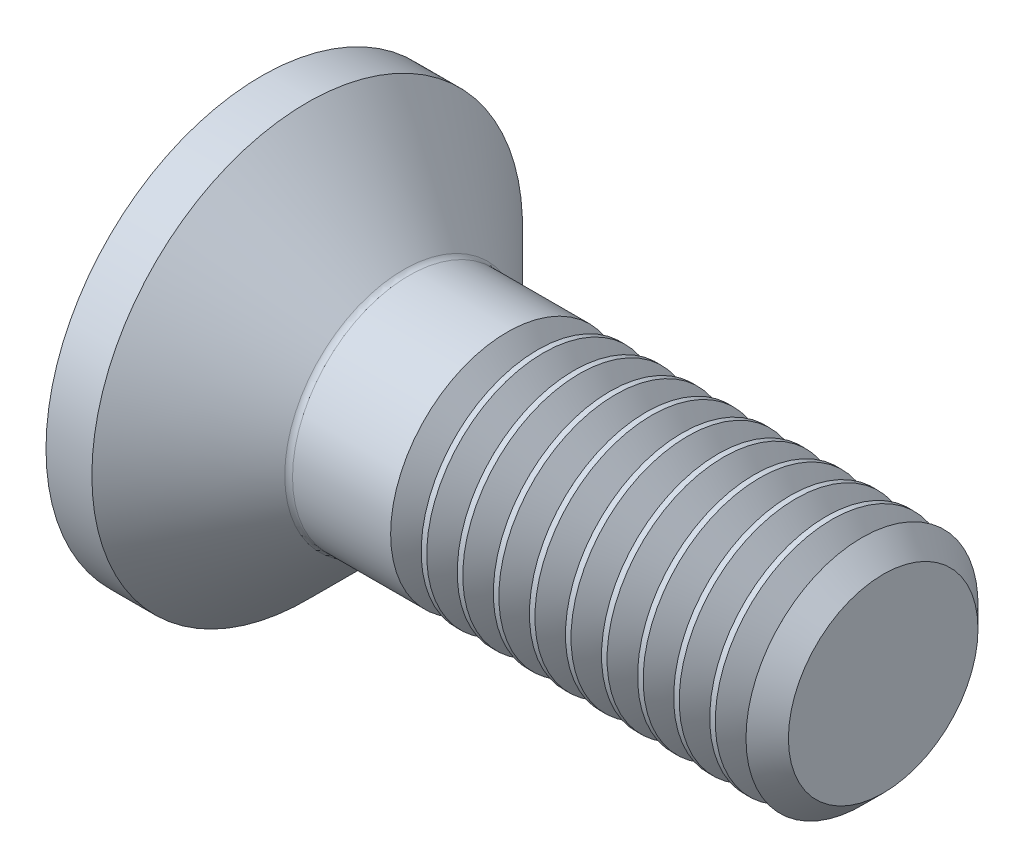
ISO-10303-21;
HEADER;
FILE_DESCRIPTION(('STEP AP214'),'2;1');
FILE_NAME('part.step','',(''),(''),'','','');
FILE_SCHEMA(('AUTOMOTIVE_DESIGN { 1 0 10303 214 1 1 1 1 }'));
ENDSEC;
DATA;
#1=APPLICATION_CONTEXT('core data for automotive mechanical design processes');
#2=APPLICATION_PROTOCOL_DEFINITION('international standard','automotive_design',2000,#1);
#3=PRODUCT_CONTEXT('',#1,'mechanical');
#4=PRODUCT('Part','Part','',(#3));
#5=PRODUCT_RELATED_PRODUCT_CATEGORY('part','',(#4));
#6=PRODUCT_DEFINITION_FORMATION('','',#4);
#7=PRODUCT_DEFINITION_CONTEXT('part definition',#1,'design');
#8=PRODUCT_DEFINITION('design','',#6,#7);
#9=PRODUCT_DEFINITION_SHAPE('','',#8);
#10=(LENGTH_UNIT() NAMED_UNIT(*) SI_UNIT(.MILLI.,.METRE.));
#11=(NAMED_UNIT(*) PLANE_ANGLE_UNIT() SI_UNIT($,.RADIAN.));
#12=(NAMED_UNIT(*) SI_UNIT($,.STERADIAN.) SOLID_ANGLE_UNIT());
#13=UNCERTAINTY_MEASURE_WITH_UNIT(LENGTH_MEASURE(1.E-05),#10,'distance_accuracy_value','');
#14=(GEOMETRIC_REPRESENTATION_CONTEXT(3) GLOBAL_UNCERTAINTY_ASSIGNED_CONTEXT((#13)) GLOBAL_UNIT_ASSIGNED_CONTEXT((#10,
#11,#12)) REPRESENTATION_CONTEXT('',''));
#15=CARTESIAN_POINT('',(0.,0.,0.));
#16=DIRECTION('',(0.,0.,1.));
#17=DIRECTION('',(1.,0.,0.));
#18=AXIS2_PLACEMENT_3D('',#15,#16,#17);
#19=CARTESIAN_POINT('',(0.,0.,0.));
#20=DIRECTION('',(-1.,0.,0.));
#21=DIRECTION('',(0.,0.,1.));
#22=AXIS2_PLACEMENT_3D('',#19,#20,#21);
#23=PLANE('',#22);
#24=CARTESIAN_POINT('',(0.,0.,0.));
#25=DIRECTION('',(-1.,0.,0.));
#26=DIRECTION('',(0.,0.,1.));
#27=AXIS2_PLACEMENT_3D('',#24,#25,#26);
#28=CIRCLE('',#27,2.77);
#29=CARTESIAN_POINT('',(0.,0.,2.77));
#30=VERTEX_POINT('',#29);
#31=EDGE_CURVE('E150',#30,#30,#28,.T.);
#32=ORIENTED_EDGE('',*,*,#31,.T.);
#33=EDGE_LOOP('',(#32));
#34=FACE_BOUND('',#33,.T.);
#35=DIRECTION('',(0.,-0.499999999999998,-0.86602540378444));
#36=VECTOR('',#35,1.);
#37=CARTESIAN_POINT('',(0.,-0.577350269189626,1.));
#38=LINE('',#37,#36);
#39=CARTESIAN_POINT('',(0.,-0.577350269189626,1.));
#40=VERTEX_POINT('',#39);
#41=CARTESIAN_POINT('',(0.,-1.15470053837925,0.));
#42=VERTEX_POINT('',#41);
#43=EDGE_CURVE('E119',#40,#42,#38,.T.);
#44=ORIENTED_EDGE('',*,*,#43,.T.);
#45=DIRECTION('',(0.,0.499999999999999,-0.866025403784439));
#46=VECTOR('',#45,1.);
#47=CARTESIAN_POINT('',(0.,-1.15470053837925,0.));
#48=LINE('',#47,#46);
#49=CARTESIAN_POINT('',(0.,-0.577350269189625,-1.));
#50=VERTEX_POINT('',#49);
#51=EDGE_CURVE('E50',#42,#50,#48,.T.);
#52=ORIENTED_EDGE('',*,*,#51,.T.);
#53=DIRECTION('',(0.,1.,0.));
#54=VECTOR('',#53,1.);
#55=CARTESIAN_POINT('',(0.,-0.577350269189625,-1.));
#56=LINE('',#55,#54);
#57=CARTESIAN_POINT('',(0.,0.577350269189626,-1.));
#58=VERTEX_POINT('',#57);
#59=EDGE_CURVE('E130',#50,#58,#56,.T.);
#60=ORIENTED_EDGE('',*,*,#59,.T.);
#61=DIRECTION('',(0.,0.5,0.866025403784439));
#62=VECTOR('',#61,1.);
#63=CARTESIAN_POINT('',(0.,0.577350269189626,-1.));
#64=LINE('',#63,#62);
#65=CARTESIAN_POINT('',(0.,1.15470053837925,0.));
#66=VERTEX_POINT('',#65);
#67=EDGE_CURVE('E415',#58,#66,#64,.T.);
#68=ORIENTED_EDGE('',*,*,#67,.T.);
#69=DIRECTION('',(0.,-0.499999999999999,0.866025403784439));
#70=VECTOR('',#69,1.);
#71=CARTESIAN_POINT('',(0.,1.15470053837925,0.));
#72=LINE('',#71,#70);
#73=CARTESIAN_POINT('',(0.,0.577350269189625,0.999999999999999));
#74=VERTEX_POINT('',#73);
#75=EDGE_CURVE('E418',#66,#74,#72,.T.);
#76=ORIENTED_EDGE('',*,*,#75,.T.);
#77=DIRECTION('',(0.,-1.,0.));
#78=VECTOR('',#77,1.);
#79=CARTESIAN_POINT('',(0.,0.577350269189625,0.999999999999999));
#80=LINE('',#79,#78);
#81=EDGE_CURVE('E421',#74,#40,#80,.T.);
#82=ORIENTED_EDGE('',*,*,#81,.T.);
#83=EDGE_LOOP('',(#44,#52,#60,#68,#76,#82));
#84=FACE_BOUND('',#83,.T.);
#85=ADVANCED_FACE('F34',(#34,#84),#23,.T.);
#86=CARTESIAN_POINT('',(0.,0.,0.));
#87=DIRECTION('',(-1.,0.,0.));
#88=DIRECTION('',(0.,0.,1.));
#89=AXIS2_PLACEMENT_3D('',#86,#87,#88);
#90=CYLINDRICAL_SURFACE('',#89,2.77);
#91=CARTESIAN_POINT('',(0.590000000000013,0.,0.));
#92=DIRECTION('',(-1.,0.,0.));
#93=DIRECTION('',(0.,0.,1.));
#94=AXIS2_PLACEMENT_3D('',#91,#92,#93);
#95=CIRCLE('',#94,2.77);
#96=CARTESIAN_POINT('',(0.590000000000013,0.,2.77));
#97=VERTEX_POINT('',#96);
#98=EDGE_CURVE('E147',#97,#97,#95,.T.);
#99=ORIENTED_EDGE('',*,*,#98,.T.);
#100=EDGE_LOOP('',(#99));
#101=FACE_BOUND('',#100,.T.);
#102=ORIENTED_EDGE('',*,*,#31,.F.);
#103=EDGE_LOOP('',(#102));
#104=FACE_BOUND('',#103,.T.);
#105=ADVANCED_FACE('F173',(#101,#104),#90,.T.);
#106=CARTESIAN_POINT('',(0.590000000000013,0.,0.));
#107=DIRECTION('',(-1.,0.,0.));
#108=DIRECTION('',(0.,0.,1.));
#109=AXIS2_PLACEMENT_3D('',#106,#107,#108);
#110=CONICAL_SURFACE('',#109,2.77,0.785398163397451);
#111=CARTESIAN_POINT('',(1.83071067811866,0.,0.));
#112=DIRECTION('',(-1.,0.,0.));
#113=DIRECTION('',(0.,0.,1.));
#114=AXIS2_PLACEMENT_3D('',#111,#112,#113);
#115=CIRCLE('',#114,1.52928932188135);
#116=CARTESIAN_POINT('',(1.83071067811866,0.,1.52928932188135));
#117=VERTEX_POINT('',#116);
#118=EDGE_CURVE('E43',#117,#117,#115,.T.);
#119=ORIENTED_EDGE('',*,*,#118,.T.);
#120=EDGE_LOOP('',(#119));
#121=FACE_BOUND('',#120,.T.);
#122=ORIENTED_EDGE('',*,*,#98,.F.);
#123=EDGE_LOOP('',(#122));
#124=FACE_BOUND('',#123,.T.);
#125=ADVANCED_FACE('F156',(#121,#124),#110,.T.);
#126=CARTESIAN_POINT('',(0.,0.,0.));
#127=DIRECTION('',(-1.,0.,0.));
#128=DIRECTION('',(0.,0.,1.));
#129=AXIS2_PLACEMENT_3D('',#126,#127,#128);
#130=CYLINDRICAL_SURFACE('',#129,1.5);
#131=CARTESIAN_POINT('',(3.16359278553217,0.,0.));
#132=DIRECTION('',(-1.,0.,0.));
#133=DIRECTION('',(0.,-1.,0.));
#134=AXIS2_PLACEMENT_3D('',#131,#132,#133);
#135=CIRCLE('',#134,1.5);
#136=CARTESIAN_POINT('',(3.16359278553217,-1.5,0.));
#137=VERTEX_POINT('',#136);
#138=EDGE_CURVE('E391',#137,#137,#135,.T.);
#139=ORIENTED_EDGE('',*,*,#138,.T.);
#140=EDGE_LOOP('',(#139));
#141=FACE_BOUND('',#140,.T.);
#142=CARTESIAN_POINT('',(1.90142135623731,0.,0.));
#143=DIRECTION('',(-1.,0.,0.));
#144=DIRECTION('',(0.,0.,1.));
#145=AXIS2_PLACEMENT_3D('',#142,#143,#144);
#146=CIRCLE('',#145,1.5);
#147=CARTESIAN_POINT('',(1.90142135623731,0.,1.5));
#148=VERTEX_POINT('',#147);
#149=EDGE_CURVE('E11',#148,#148,#146,.F.);
#150=ORIENTED_EDGE('',*,*,#149,.T.);
#151=EDGE_LOOP('',(#150));
#152=FACE_BOUND('',#151,.T.);
#153=ADVANCED_FACE('F160',(#141,#152),#130,.T.);
#154=CARTESIAN_POINT('',(1.90142135623731,0.,0.));
#155=DIRECTION('',(-1.,0.,0.));
#156=DIRECTION('',(0.,0.,1.));
#157=AXIS2_PLACEMENT_3D('',#154,#155,#156);
#158=TOROIDAL_SURFACE('',#157,1.6,0.1);
#159=ORIENTED_EDGE('',*,*,#149,.F.);
#160=EDGE_LOOP('',(#159));
#161=FACE_BOUND('',#160,.T.);
#162=ORIENTED_EDGE('',*,*,#118,.F.);
#163=EDGE_LOOP('',(#162));
#164=FACE_BOUND('',#163,.T.);
#165=ADVANCED_FACE('F36',(#161,#164),#158,.F.);
#166=CARTESIAN_POINT('',(1.1,-1.15470053837925,0.));
#167=DIRECTION('',(0.,0.866025403784439,0.499999999999999));
#168=DIRECTION('',(0.,-0.499999999999999,0.866025403784439));
#169=AXIS2_PLACEMENT_3D('',#166,#167,#168);
#170=PLANE('',#169);
#171=ORIENTED_EDGE('',*,*,#51,.F.);
#172=DIRECTION('',(-1.,0.,0.));
#173=VECTOR('',#172,1.);
#174=CARTESIAN_POINT('',(1.1,-1.15470053837925,0.));
#175=LINE('',#174,#173);
#176=CARTESIAN_POINT('',(1.1,-1.15470053837925,0.));
#177=VERTEX_POINT('',#176);
#178=EDGE_CURVE('E412',#177,#42,#175,.T.);
#179=ORIENTED_EDGE('',*,*,#178,.F.);
#180=DIRECTION('',(0.,0.499999999999999,-0.866025403784439));
#181=VECTOR('',#180,1.);
#182=CARTESIAN_POINT('',(1.1,-1.15470053837925,0.));
#183=LINE('',#182,#181);
#184=CARTESIAN_POINT('',(1.1,-0.866025403784438,-0.499999999999998));
#185=VERTEX_POINT('',#184);
#186=EDGE_CURVE('E115',#177,#185,#183,.T.);
#187=ORIENTED_EDGE('',*,*,#186,.T.);
#188=CARTESIAN_POINT('',(1.1,-0.577350269189625,-1.));
#189=VERTEX_POINT('',#188);
#190=EDGE_CURVE('E111',#185,#189,#183,.T.);
#191=ORIENTED_EDGE('',*,*,#190,.T.);
#192=DIRECTION('',(-1.,0.,0.));
#193=VECTOR('',#192,1.);
#194=CARTESIAN_POINT('',(1.1,-0.577350269189625,-1.));
#195=LINE('',#194,#193);
#196=EDGE_CURVE('E113',#189,#50,#195,.T.);
#197=ORIENTED_EDGE('',*,*,#196,.T.);
#198=EDGE_LOOP('',(#171,#179,#187,#191,#197));
#199=FACE_BOUND('',#198,.T.);
#200=ADVANCED_FACE('F112',(#199),#170,.T.);
#201=CARTESIAN_POINT('',(1.1,-0.577350269189625,-1.));
#202=DIRECTION('',(0.,0.,1.));
#203=DIRECTION('',(1.,0.,0.));
#204=AXIS2_PLACEMENT_3D('',#201,#202,#203);
#205=PLANE('',#204);
#206=ORIENTED_EDGE('',*,*,#59,.F.);
#207=ORIENTED_EDGE('',*,*,#196,.F.);
#208=DIRECTION('',(0.,1.,0.));
#209=VECTOR('',#208,1.);
#210=CARTESIAN_POINT('',(1.1,-0.577350269189625,-1.));
#211=LINE('',#210,#209);
#212=CARTESIAN_POINT('',(1.1,0.,-1.));
#213=VERTEX_POINT('',#212);
#214=EDGE_CURVE('E58',#189,#213,#211,.T.);
#215=ORIENTED_EDGE('',*,*,#214,.T.);
#216=CARTESIAN_POINT('',(1.1,0.577350269189626,-1.));
#217=VERTEX_POINT('',#216);
#218=EDGE_CURVE('E125',#213,#217,#211,.T.);
#219=ORIENTED_EDGE('',*,*,#218,.T.);
#220=DIRECTION('',(-1.,0.,0.));
#221=VECTOR('',#220,1.);
#222=CARTESIAN_POINT('',(1.1,0.577350269189626,-1.));
#223=LINE('',#222,#221);
#224=EDGE_CURVE('E132',#217,#58,#223,.T.);
#225=ORIENTED_EDGE('',*,*,#224,.T.);
#226=EDGE_LOOP('',(#206,#207,#215,#219,#225));
#227=FACE_BOUND('',#226,.T.);
#228=ADVANCED_FACE('F127',(#227),#205,.T.);
#229=CARTESIAN_POINT('',(1.1,0.577350269189626,-1.));
#230=DIRECTION('',(0.,-0.866025403784438,0.5));
#231=DIRECTION('',(0.,-0.5,-0.866025403784439));
#232=AXIS2_PLACEMENT_3D('',#229,#230,#231);
#233=PLANE('',#232);
#234=ORIENTED_EDGE('',*,*,#67,.F.);
#235=ORIENTED_EDGE('',*,*,#224,.F.);
#236=DIRECTION('',(0.,0.5,0.866025403784439));
#237=VECTOR('',#236,1.);
#238=CARTESIAN_POINT('',(1.1,0.577350269189626,-1.));
#239=LINE('',#238,#237);
#240=CARTESIAN_POINT('',(1.1,0.866025403784439,-0.5));
#241=VERTEX_POINT('',#240);
#242=EDGE_CURVE('E397',#217,#241,#239,.T.);
#243=ORIENTED_EDGE('',*,*,#242,.T.);
#244=CARTESIAN_POINT('',(1.1,1.15470053837925,0.));
#245=VERTEX_POINT('',#244);
#246=EDGE_CURVE('E124',#241,#245,#239,.T.);
#247=ORIENTED_EDGE('',*,*,#246,.T.);
#248=DIRECTION('',(-1.,0.,0.));
#249=VECTOR('',#248,1.);
#250=CARTESIAN_POINT('',(1.1,1.15470053837925,0.));
#251=LINE('',#250,#249);
#252=EDGE_CURVE('E138',#245,#66,#251,.T.);
#253=ORIENTED_EDGE('',*,*,#252,.T.);
#254=EDGE_LOOP('',(#234,#235,#243,#247,#253));
#255=FACE_BOUND('',#254,.T.);
#256=ADVANCED_FACE('F201',(#255),#233,.T.);
#257=CARTESIAN_POINT('',(1.1,1.15470053837925,0.));
#258=DIRECTION('',(0.,-0.866025403784439,-0.499999999999999));
#259=DIRECTION('',(0.,0.499999999999999,-0.866025403784439));
#260=AXIS2_PLACEMENT_3D('',#257,#258,#259);
#261=PLANE('',#260);
#262=ORIENTED_EDGE('',*,*,#75,.F.);
#263=ORIENTED_EDGE('',*,*,#252,.F.);
#264=DIRECTION('',(0.,-0.499999999999999,0.866025403784439));
#265=VECTOR('',#264,1.);
#266=CARTESIAN_POINT('',(1.1,1.15470053837925,0.));
#267=LINE('',#266,#265);
#268=CARTESIAN_POINT('',(1.1,0.866025403784438,0.499999999999999));
#269=VERTEX_POINT('',#268);
#270=EDGE_CURVE('E401',#245,#269,#267,.T.);
#271=ORIENTED_EDGE('',*,*,#270,.T.);
#272=CARTESIAN_POINT('',(1.1,0.577350269189625,0.999999999999999));
#273=VERTEX_POINT('',#272);
#274=EDGE_CURVE('E400',#269,#273,#267,.T.);
#275=ORIENTED_EDGE('',*,*,#274,.T.);
#276=DIRECTION('',(-1.,0.,0.));
#277=VECTOR('',#276,1.);
#278=CARTESIAN_POINT('',(1.1,0.577350269189625,0.999999999999999));
#279=LINE('',#278,#277);
#280=EDGE_CURVE('E430',#273,#74,#279,.T.);
#281=ORIENTED_EDGE('',*,*,#280,.T.);
#282=EDGE_LOOP('',(#262,#263,#271,#275,#281));
#283=FACE_BOUND('',#282,.T.);
#284=ADVANCED_FACE('F204',(#283),#261,.T.);
#285=CARTESIAN_POINT('',(1.1,0.577350269189625,0.999999999999999));
#286=DIRECTION('',(0.,0.,-1.));
#287=DIRECTION('',(0.,1.,0.));
#288=AXIS2_PLACEMENT_3D('',#285,#286,#287);
#289=PLANE('',#288);
#290=ORIENTED_EDGE('',*,*,#81,.F.);
#291=ORIENTED_EDGE('',*,*,#280,.F.);
#292=DIRECTION('',(0.,-1.,0.));
#293=VECTOR('',#292,1.);
#294=CARTESIAN_POINT('',(1.1,0.577350269189625,0.999999999999999));
#295=LINE('',#294,#293);
#296=CARTESIAN_POINT('',(1.1,0.,1.));
#297=VERTEX_POINT('',#296);
#298=EDGE_CURVE('E405',#273,#297,#295,.T.);
#299=ORIENTED_EDGE('',*,*,#298,.T.);
#300=CARTESIAN_POINT('',(1.1,-0.577350269189626,1.));
#301=VERTEX_POINT('',#300);
#302=EDGE_CURVE('E404',#297,#301,#295,.T.);
#303=ORIENTED_EDGE('',*,*,#302,.T.);
#304=DIRECTION('',(-1.,0.,0.));
#305=VECTOR('',#304,1.);
#306=CARTESIAN_POINT('',(1.1,-0.577350269189626,1.));
#307=LINE('',#306,#305);
#308=EDGE_CURVE('E427',#301,#40,#307,.T.);
#309=ORIENTED_EDGE('',*,*,#308,.T.);
#310=EDGE_LOOP('',(#290,#291,#299,#303,#309));
#311=FACE_BOUND('',#310,.T.);
#312=ADVANCED_FACE('F208',(#311),#289,.T.);
#313=CARTESIAN_POINT('',(1.1,-0.577350269189626,1.));
#314=DIRECTION('',(0.,0.86602540378444,-0.499999999999998));
#315=DIRECTION('',(0.,0.499999999999998,0.86602540378444));
#316=AXIS2_PLACEMENT_3D('',#313,#314,#315);
#317=PLANE('',#316);
#318=ORIENTED_EDGE('',*,*,#43,.F.);
#319=ORIENTED_EDGE('',*,*,#308,.F.);
#320=DIRECTION('',(0.,-0.499999999999998,-0.86602540378444));
#321=VECTOR('',#320,1.);
#322=CARTESIAN_POINT('',(1.1,-0.577350269189626,1.));
#323=LINE('',#322,#321);
#324=CARTESIAN_POINT('',(1.1,-0.866025403784439,0.499999999999997));
#325=VERTEX_POINT('',#324);
#326=EDGE_CURVE('E409',#301,#325,#323,.T.);
#327=ORIENTED_EDGE('',*,*,#326,.T.);
#328=EDGE_CURVE('E408',#325,#177,#323,.T.);
#329=ORIENTED_EDGE('',*,*,#328,.T.);
#330=ORIENTED_EDGE('',*,*,#178,.T.);
#331=EDGE_LOOP('',(#318,#319,#327,#329,#330));
#332=FACE_BOUND('',#331,.T.);
#333=ADVANCED_FACE('F212',(#332),#317,.T.);
#334=CARTESIAN_POINT('',(1.1,-0.577350269189626,-1.));
#335=DIRECTION('',(1.,0.,0.));
#336=DIRECTION('',(0.,0.,-1.));
#337=AXIS2_PLACEMENT_3D('',#334,#335,#336);
#338=PLANE('',#337);
#339=ORIENTED_EDGE('',*,*,#214,.F.);
#340=ORIENTED_EDGE('',*,*,#190,.F.);
#341=CARTESIAN_POINT('',(1.1,0.,0.));
#342=DIRECTION('',(-1.,0.,0.));
#343=DIRECTION('',(0.,0.,1.));
#344=AXIS2_PLACEMENT_3D('',#341,#342,#343);
#345=CIRCLE('',#344,1.);
#346=EDGE_CURVE('E122',#213,#185,#345,.T.);
#347=ORIENTED_EDGE('',*,*,#346,.F.);
#348=EDGE_LOOP('',(#339,#340,#347));
#349=FACE_BOUND('',#348,.T.);
#350=ADVANCED_FACE('F121',(#349),#338,.F.);
#351=ORIENTED_EDGE('',*,*,#186,.F.);
#352=ORIENTED_EDGE('',*,*,#328,.F.);
#353=EDGE_CURVE('E135',#185,#325,#345,.T.);
#354=ORIENTED_EDGE('',*,*,#353,.F.);
#355=EDGE_LOOP('',(#351,#352,#354));
#356=FACE_BOUND('',#355,.T.);
#357=ADVANCED_FACE('F219',(#356),#338,.F.);
#358=ORIENTED_EDGE('',*,*,#326,.F.);
#359=ORIENTED_EDGE('',*,*,#302,.F.);
#360=EDGE_CURVE('E131',#325,#297,#345,.T.);
#361=ORIENTED_EDGE('',*,*,#360,.F.);
#362=EDGE_LOOP('',(#358,#359,#361));
#363=FACE_BOUND('',#362,.T.);
#364=ADVANCED_FACE('F443',(#363),#338,.F.);
#365=ORIENTED_EDGE('',*,*,#298,.F.);
#366=ORIENTED_EDGE('',*,*,#274,.F.);
#367=EDGE_CURVE('E137',#297,#269,#345,.T.);
#368=ORIENTED_EDGE('',*,*,#367,.F.);
#369=EDGE_LOOP('',(#365,#366,#368));
#370=FACE_BOUND('',#369,.T.);
#371=ADVANCED_FACE('F454',(#370),#338,.F.);
#372=ORIENTED_EDGE('',*,*,#270,.F.);
#373=ORIENTED_EDGE('',*,*,#246,.F.);
#374=EDGE_CURVE('E144',#269,#241,#345,.T.);
#375=ORIENTED_EDGE('',*,*,#374,.F.);
#376=EDGE_LOOP('',(#372,#373,#375));
#377=FACE_BOUND('',#376,.T.);
#378=ADVANCED_FACE('F452',(#377),#338,.F.);
#379=ORIENTED_EDGE('',*,*,#242,.F.);
#380=ORIENTED_EDGE('',*,*,#218,.F.);
#381=EDGE_CURVE('E448',#241,#213,#345,.T.);
#382=ORIENTED_EDGE('',*,*,#381,.F.);
#383=EDGE_LOOP('',(#379,#380,#382));
#384=FACE_BOUND('',#383,.T.);
#385=ADVANCED_FACE('F196',(#384),#338,.F.);
#386=CARTESIAN_POINT('',(1.1,0.,0.));
#387=DIRECTION('',(-1.,0.,0.));
#388=DIRECTION('',(0.,0.,1.));
#389=AXIS2_PLACEMENT_3D('',#386,#387,#388);
#390=CONICAL_SURFACE('',#389,1.,1.04719755119659);
#391=CARTESIAN_POINT('',(1.67735026918963,0.,0.));
#392=VERTEX_POINT('',#391);
#393=VERTEX_LOOP('',#392);
#394=FACE_BOUND('',#393,.T.);
#395=ORIENTED_EDGE('',*,*,#367,.T.);
#396=ORIENTED_EDGE('',*,*,#374,.T.);
#397=ORIENTED_EDGE('',*,*,#381,.T.);
#398=ORIENTED_EDGE('',*,*,#346,.T.);
#399=ORIENTED_EDGE('',*,*,#353,.T.);
#400=ORIENTED_EDGE('',*,*,#360,.T.);
#401=EDGE_LOOP('',(#395,#396,#397,#398,#399,#400));
#402=FACE_BOUND('',#401,.T.);
#403=ADVANCED_FACE('F193',(#394,#402),#390,.F.);
#404=CARTESIAN_POINT('',(3.55640921446782,0.,0.));
#405=DIRECTION('',(1.,0.,0.));
#406=DIRECTION('',(0.,1.,0.));
#407=AXIS2_PLACEMENT_3D('',#404,#405,#406);
#408=CONICAL_SURFACE('',#407,1.5,0.959931088596882);
#409=CARTESIAN_POINT('',(3.360001,0.,0.));
#410=DIRECTION('',(-1.,0.,0.));
#411=DIRECTION('',(0.,-1.,0.));
#412=AXIS2_PLACEMENT_3D('',#409,#410,#411);
#413=CIRCLE('',#412,1.2195);
#414=CARTESIAN_POINT('',(3.360001,-1.2195,0.));
#415=VERTEX_POINT('',#414);
#416=EDGE_CURVE('E388',#415,#415,#413,.T.);
#417=ORIENTED_EDGE('',*,*,#416,.F.);
#418=EDGE_LOOP('',(#417));
#419=FACE_BOUND('',#418,.T.);
#420=CARTESIAN_POINT('',(3.55640921446782,0.,0.));
#421=DIRECTION('',(-1.,0.,0.));
#422=DIRECTION('',(0.,-1.,0.));
#423=AXIS2_PLACEMENT_3D('',#420,#421,#422);
#424=CIRCLE('',#423,1.5);
#425=CARTESIAN_POINT('',(3.55640921446782,-1.5,0.));
#426=VERTEX_POINT('',#425);
#427=EDGE_CURVE('E394',#426,#426,#424,.T.);
#428=ORIENTED_EDGE('',*,*,#427,.T.);
#429=EDGE_LOOP('',(#428));
#430=FACE_BOUND('',#429,.T.);
#431=ADVANCED_FACE('F195',(#419,#430),#408,.T.);
#432=CARTESIAN_POINT('',(3.360001,0.,0.));
#433=DIRECTION('',(-1.,0.,0.));
#434=DIRECTION('',(0.,-1.,0.));
#435=AXIS2_PLACEMENT_3D('',#432,#433,#434);
#436=CONICAL_SURFACE('',#435,1.2195,0.959931088596878);
#437=ORIENTED_EDGE('',*,*,#138,.F.);
#438=EDGE_LOOP('',(#437));
#439=FACE_BOUND('',#438,.T.);
#440=ORIENTED_EDGE('',*,*,#416,.T.);
#441=EDGE_LOOP('',(#440));
#442=FACE_BOUND('',#441,.T.);
#443=ADVANCED_FACE('F222',(#439,#442),#436,.T.);
#444=CARTESIAN_POINT('',(3.62759278553217,0.,0.));
#445=DIRECTION('',(-1.,0.,0.));
#446=DIRECTION('',(0.,-1.,0.));
#447=AXIS2_PLACEMENT_3D('',#444,#445,#446);
#448=CIRCLE('',#447,1.5);
#449=CARTESIAN_POINT('',(3.62759278553217,-1.5,0.));
#450=VERTEX_POINT('',#449);
#451=EDGE_CURVE('E382',#450,#450,#448,.T.);
#452=ORIENTED_EDGE('',*,*,#451,.T.);
#453=EDGE_LOOP('',(#452));
#454=FACE_BOUND('',#453,.T.);
#455=ORIENTED_EDGE('',*,*,#427,.F.);
#456=EDGE_LOOP('',(#455));
#457=FACE_BOUND('',#456,.T.);
#458=ADVANCED_FACE('F170',(#454,#457),#130,.T.);
#459=CARTESIAN_POINT('',(4.02040921446782,0.,0.));
#460=DIRECTION('',(1.,0.,0.));
#461=DIRECTION('',(0.,1.,0.));
#462=AXIS2_PLACEMENT_3D('',#459,#460,#461);
#463=CONICAL_SURFACE('',#462,1.5,0.959931088596882);
#464=CARTESIAN_POINT('',(3.824001,0.,0.));
#465=DIRECTION('',(-1.,0.,0.));
#466=DIRECTION('',(0.,-1.,0.));
#467=AXIS2_PLACEMENT_3D('',#464,#465,#466);
#468=CIRCLE('',#467,1.2195);
#469=CARTESIAN_POINT('',(3.824001,-1.2195,0.));
#470=VERTEX_POINT('',#469);
#471=EDGE_CURVE('E379',#470,#470,#468,.T.);
#472=ORIENTED_EDGE('',*,*,#471,.F.);
#473=EDGE_LOOP('',(#472));
#474=FACE_BOUND('',#473,.T.);
#475=CARTESIAN_POINT('',(4.02040921446782,0.,0.));
#476=DIRECTION('',(-1.,0.,0.));
#477=DIRECTION('',(0.,-1.,0.));
#478=AXIS2_PLACEMENT_3D('',#475,#476,#477);
#479=CIRCLE('',#478,1.5);
#480=CARTESIAN_POINT('',(4.02040921446782,-1.5,0.));
#481=VERTEX_POINT('',#480);
#482=EDGE_CURVE('E385',#481,#481,#479,.T.);
#483=ORIENTED_EDGE('',*,*,#482,.T.);
#484=EDGE_LOOP('',(#483));
#485=FACE_BOUND('',#484,.T.);
#486=ADVANCED_FACE('F227',(#474,#485),#463,.T.);
#487=CARTESIAN_POINT('',(3.824001,0.,0.));
#488=DIRECTION('',(-1.,0.,0.));
#489=DIRECTION('',(0.,-1.,0.));
#490=AXIS2_PLACEMENT_3D('',#487,#488,#489);
#491=CONICAL_SURFACE('',#490,1.2195,0.959931088596878);
#492=ORIENTED_EDGE('',*,*,#451,.F.);
#493=EDGE_LOOP('',(#492));
#494=FACE_BOUND('',#493,.T.);
#495=ORIENTED_EDGE('',*,*,#471,.T.);
#496=EDGE_LOOP('',(#495));
#497=FACE_BOUND('',#496,.T.);
#498=ADVANCED_FACE('F230',(#494,#497),#491,.T.);
#499=CARTESIAN_POINT('',(4.09159278553217,0.,0.));
#500=DIRECTION('',(-1.,0.,0.));
#501=DIRECTION('',(0.,-1.,0.));
#502=AXIS2_PLACEMENT_3D('',#499,#500,#501);
#503=CIRCLE('',#502,1.5);
#504=CARTESIAN_POINT('',(4.09159278553217,-1.5,0.));
#505=VERTEX_POINT('',#504);
#506=EDGE_CURVE('E373',#505,#505,#503,.T.);
#507=ORIENTED_EDGE('',*,*,#506,.T.);
#508=EDGE_LOOP('',(#507));
#509=FACE_BOUND('',#508,.T.);
#510=ORIENTED_EDGE('',*,*,#482,.F.);
#511=EDGE_LOOP('',(#510));
#512=FACE_BOUND('',#511,.T.);
#513=ADVANCED_FACE('F234',(#509,#512),#130,.T.);
#514=CARTESIAN_POINT('',(4.48440921446782,0.,0.));
#515=DIRECTION('',(1.,0.,0.));
#516=DIRECTION('',(0.,1.,0.));
#517=AXIS2_PLACEMENT_3D('',#514,#515,#516);
#518=CONICAL_SURFACE('',#517,1.5,0.959931088596882);
#519=CARTESIAN_POINT('',(4.288001,0.,0.));
#520=DIRECTION('',(-1.,0.,0.));
#521=DIRECTION('',(0.,-1.,0.));
#522=AXIS2_PLACEMENT_3D('',#519,#520,#521);
#523=CIRCLE('',#522,1.2195);
#524=CARTESIAN_POINT('',(4.288001,-1.2195,0.));
#525=VERTEX_POINT('',#524);
#526=EDGE_CURVE('E370',#525,#525,#523,.T.);
#527=ORIENTED_EDGE('',*,*,#526,.F.);
#528=EDGE_LOOP('',(#527));
#529=FACE_BOUND('',#528,.T.);
#530=CARTESIAN_POINT('',(4.48440921446782,0.,0.));
#531=DIRECTION('',(-1.,0.,0.));
#532=DIRECTION('',(0.,-1.,0.));
#533=AXIS2_PLACEMENT_3D('',#530,#531,#532);
#534=CIRCLE('',#533,1.5);
#535=CARTESIAN_POINT('',(4.48440921446782,-1.5,0.));
#536=VERTEX_POINT('',#535);
#537=EDGE_CURVE('E376',#536,#536,#534,.T.);
#538=ORIENTED_EDGE('',*,*,#537,.T.);
#539=EDGE_LOOP('',(#538));
#540=FACE_BOUND('',#539,.T.);
#541=ADVANCED_FACE('F236',(#529,#540),#518,.T.);
#542=CARTESIAN_POINT('',(4.288001,0.,0.));
#543=DIRECTION('',(-1.,0.,0.));
#544=DIRECTION('',(0.,-1.,0.));
#545=AXIS2_PLACEMENT_3D('',#542,#543,#544);
#546=CONICAL_SURFACE('',#545,1.2195,0.959931088596878);
#547=ORIENTED_EDGE('',*,*,#506,.F.);
#548=EDGE_LOOP('',(#547));
#549=FACE_BOUND('',#548,.T.);
#550=ORIENTED_EDGE('',*,*,#526,.T.);
#551=EDGE_LOOP('',(#550));
#552=FACE_BOUND('',#551,.T.);
#553=ADVANCED_FACE('F239',(#549,#552),#546,.T.);
#554=CARTESIAN_POINT('',(4.55559278553217,0.,0.));
#555=DIRECTION('',(-1.,0.,0.));
#556=DIRECTION('',(0.,-1.,0.));
#557=AXIS2_PLACEMENT_3D('',#554,#555,#556);
#558=CIRCLE('',#557,1.5);
#559=CARTESIAN_POINT('',(4.55559278553217,-1.5,0.));
#560=VERTEX_POINT('',#559);
#561=EDGE_CURVE('E364',#560,#560,#558,.T.);
#562=ORIENTED_EDGE('',*,*,#561,.T.);
#563=EDGE_LOOP('',(#562));
#564=FACE_BOUND('',#563,.T.);
#565=ORIENTED_EDGE('',*,*,#537,.F.);
#566=EDGE_LOOP('',(#565));
#567=FACE_BOUND('',#566,.T.);
#568=ADVANCED_FACE('F243',(#564,#567),#130,.T.);
#569=CARTESIAN_POINT('',(4.94840921446782,0.,0.));
#570=DIRECTION('',(1.,0.,0.));
#571=DIRECTION('',(0.,1.,0.));
#572=AXIS2_PLACEMENT_3D('',#569,#570,#571);
#573=CONICAL_SURFACE('',#572,1.5,0.959931088596882);
#574=CARTESIAN_POINT('',(4.752001,0.,0.));
#575=DIRECTION('',(-1.,0.,0.));
#576=DIRECTION('',(0.,-1.,0.));
#577=AXIS2_PLACEMENT_3D('',#574,#575,#576);
#578=CIRCLE('',#577,1.2195);
#579=CARTESIAN_POINT('',(4.752001,-1.2195,0.));
#580=VERTEX_POINT('',#579);
#581=EDGE_CURVE('E361',#580,#580,#578,.T.);
#582=ORIENTED_EDGE('',*,*,#581,.F.);
#583=EDGE_LOOP('',(#582));
#584=FACE_BOUND('',#583,.T.);
#585=CARTESIAN_POINT('',(4.94840921446782,0.,0.));
#586=DIRECTION('',(-1.,0.,0.));
#587=DIRECTION('',(0.,-1.,0.));
#588=AXIS2_PLACEMENT_3D('',#585,#586,#587);
#589=CIRCLE('',#588,1.5);
#590=CARTESIAN_POINT('',(4.94840921446782,-1.5,0.));
#591=VERTEX_POINT('',#590);
#592=EDGE_CURVE('E367',#591,#591,#589,.T.);
#593=ORIENTED_EDGE('',*,*,#592,.T.);
#594=EDGE_LOOP('',(#593));
#595=FACE_BOUND('',#594,.T.);
#596=ADVANCED_FACE('F245',(#584,#595),#573,.T.);
#597=CARTESIAN_POINT('',(4.752001,0.,0.));
#598=DIRECTION('',(-1.,0.,0.));
#599=DIRECTION('',(0.,-1.,0.));
#600=AXIS2_PLACEMENT_3D('',#597,#598,#599);
#601=CONICAL_SURFACE('',#600,1.2195,0.959931088596878);
#602=ORIENTED_EDGE('',*,*,#561,.F.);
#603=EDGE_LOOP('',(#602));
#604=FACE_BOUND('',#603,.T.);
#605=ORIENTED_EDGE('',*,*,#581,.T.);
#606=EDGE_LOOP('',(#605));
#607=FACE_BOUND('',#606,.T.);
#608=ADVANCED_FACE('F248',(#604,#607),#601,.T.);
#609=CARTESIAN_POINT('',(5.01959278553217,0.,0.));
#610=DIRECTION('',(-1.,0.,0.));
#611=DIRECTION('',(0.,-1.,0.));
#612=AXIS2_PLACEMENT_3D('',#609,#610,#611);
#613=CIRCLE('',#612,1.5);
#614=CARTESIAN_POINT('',(5.01959278553217,-1.5,0.));
#615=VERTEX_POINT('',#614);
#616=EDGE_CURVE('E355',#615,#615,#613,.T.);
#617=ORIENTED_EDGE('',*,*,#616,.T.);
#618=EDGE_LOOP('',(#617));
#619=FACE_BOUND('',#618,.T.);
#620=ORIENTED_EDGE('',*,*,#592,.F.);
#621=EDGE_LOOP('',(#620));
#622=FACE_BOUND('',#621,.T.);
#623=ADVANCED_FACE('F252',(#619,#622),#130,.T.);
#624=CARTESIAN_POINT('',(5.41240921446782,0.,0.));
#625=DIRECTION('',(1.,0.,0.));
#626=DIRECTION('',(0.,1.,0.));
#627=AXIS2_PLACEMENT_3D('',#624,#625,#626);
#628=CONICAL_SURFACE('',#627,1.5,0.959931088596882);
#629=CARTESIAN_POINT('',(5.216001,0.,0.));
#630=DIRECTION('',(-1.,0.,0.));
#631=DIRECTION('',(0.,-1.,0.));
#632=AXIS2_PLACEMENT_3D('',#629,#630,#631);
#633=CIRCLE('',#632,1.2195);
#634=CARTESIAN_POINT('',(5.216001,-1.2195,0.));
#635=VERTEX_POINT('',#634);
#636=EDGE_CURVE('E352',#635,#635,#633,.T.);
#637=ORIENTED_EDGE('',*,*,#636,.F.);
#638=EDGE_LOOP('',(#637));
#639=FACE_BOUND('',#638,.T.);
#640=CARTESIAN_POINT('',(5.41240921446782,0.,0.));
#641=DIRECTION('',(-1.,0.,0.));
#642=DIRECTION('',(0.,-1.,0.));
#643=AXIS2_PLACEMENT_3D('',#640,#641,#642);
#644=CIRCLE('',#643,1.5);
#645=CARTESIAN_POINT('',(5.41240921446782,-1.5,0.));
#646=VERTEX_POINT('',#645);
#647=EDGE_CURVE('E358',#646,#646,#644,.T.);
#648=ORIENTED_EDGE('',*,*,#647,.T.);
#649=EDGE_LOOP('',(#648));
#650=FACE_BOUND('',#649,.T.);
#651=ADVANCED_FACE('F254',(#639,#650),#628,.T.);
#652=CARTESIAN_POINT('',(5.216001,0.,0.));
#653=DIRECTION('',(-1.,0.,0.));
#654=DIRECTION('',(0.,-1.,0.));
#655=AXIS2_PLACEMENT_3D('',#652,#653,#654);
#656=CONICAL_SURFACE('',#655,1.2195,0.959931088596878);
#657=ORIENTED_EDGE('',*,*,#616,.F.);
#658=EDGE_LOOP('',(#657));
#659=FACE_BOUND('',#658,.T.);
#660=ORIENTED_EDGE('',*,*,#636,.T.);
#661=EDGE_LOOP('',(#660));
#662=FACE_BOUND('',#661,.T.);
#663=ADVANCED_FACE('F257',(#659,#662),#656,.T.);
#664=CARTESIAN_POINT('',(5.48359278553217,0.,0.));
#665=DIRECTION('',(-1.,0.,0.));
#666=DIRECTION('',(0.,-1.,0.));
#667=AXIS2_PLACEMENT_3D('',#664,#665,#666);
#668=CIRCLE('',#667,1.5);
#669=CARTESIAN_POINT('',(5.48359278553217,-1.5,0.));
#670=VERTEX_POINT('',#669);
#671=EDGE_CURVE('E346',#670,#670,#668,.T.);
#672=ORIENTED_EDGE('',*,*,#671,.T.);
#673=EDGE_LOOP('',(#672));
#674=FACE_BOUND('',#673,.T.);
#675=ORIENTED_EDGE('',*,*,#647,.F.);
#676=EDGE_LOOP('',(#675));
#677=FACE_BOUND('',#676,.T.);
#678=ADVANCED_FACE('F261',(#674,#677),#130,.T.);
#679=CARTESIAN_POINT('',(5.87640921446782,0.,0.));
#680=DIRECTION('',(1.,0.,0.));
#681=DIRECTION('',(0.,1.,0.));
#682=AXIS2_PLACEMENT_3D('',#679,#680,#681);
#683=CONICAL_SURFACE('',#682,1.5,0.959931088596882);
#684=CARTESIAN_POINT('',(5.680001,0.,0.));
#685=DIRECTION('',(-1.,0.,0.));
#686=DIRECTION('',(0.,-1.,0.));
#687=AXIS2_PLACEMENT_3D('',#684,#685,#686);
#688=CIRCLE('',#687,1.2195);
#689=CARTESIAN_POINT('',(5.680001,-1.2195,0.));
#690=VERTEX_POINT('',#689);
#691=EDGE_CURVE('E343',#690,#690,#688,.T.);
#692=ORIENTED_EDGE('',*,*,#691,.F.);
#693=EDGE_LOOP('',(#692));
#694=FACE_BOUND('',#693,.T.);
#695=CARTESIAN_POINT('',(5.87640921446782,0.,0.));
#696=DIRECTION('',(-1.,0.,0.));
#697=DIRECTION('',(0.,-1.,0.));
#698=AXIS2_PLACEMENT_3D('',#695,#696,#697);
#699=CIRCLE('',#698,1.5);
#700=CARTESIAN_POINT('',(5.87640921446782,-1.5,0.));
#701=VERTEX_POINT('',#700);
#702=EDGE_CURVE('E349',#701,#701,#699,.T.);
#703=ORIENTED_EDGE('',*,*,#702,.T.);
#704=EDGE_LOOP('',(#703));
#705=FACE_BOUND('',#704,.T.);
#706=ADVANCED_FACE('F263',(#694,#705),#683,.T.);
#707=CARTESIAN_POINT('',(5.680001,0.,0.));
#708=DIRECTION('',(-1.,0.,0.));
#709=DIRECTION('',(0.,-1.,0.));
#710=AXIS2_PLACEMENT_3D('',#707,#708,#709);
#711=CONICAL_SURFACE('',#710,1.2195,0.959931088596878);
#712=ORIENTED_EDGE('',*,*,#671,.F.);
#713=EDGE_LOOP('',(#712));
#714=FACE_BOUND('',#713,.T.);
#715=ORIENTED_EDGE('',*,*,#691,.T.);
#716=EDGE_LOOP('',(#715));
#717=FACE_BOUND('',#716,.T.);
#718=ADVANCED_FACE('F266',(#714,#717),#711,.T.);
#719=CARTESIAN_POINT('',(5.94759278553217,0.,0.));
#720=DIRECTION('',(-1.,0.,0.));
#721=DIRECTION('',(0.,-1.,0.));
#722=AXIS2_PLACEMENT_3D('',#719,#720,#721);
#723=CIRCLE('',#722,1.5);
#724=CARTESIAN_POINT('',(5.94759278553217,-1.5,0.));
#725=VERTEX_POINT('',#724);
#726=EDGE_CURVE('E337',#725,#725,#723,.T.);
#727=ORIENTED_EDGE('',*,*,#726,.T.);
#728=EDGE_LOOP('',(#727));
#729=FACE_BOUND('',#728,.T.);
#730=ORIENTED_EDGE('',*,*,#702,.F.);
#731=EDGE_LOOP('',(#730));
#732=FACE_BOUND('',#731,.T.);
#733=ADVANCED_FACE('F270',(#729,#732),#130,.T.);
#734=CARTESIAN_POINT('',(6.34040921446782,0.,0.));
#735=DIRECTION('',(1.,0.,0.));
#736=DIRECTION('',(0.,1.,0.));
#737=AXIS2_PLACEMENT_3D('',#734,#735,#736);
#738=CONICAL_SURFACE('',#737,1.5,0.959931088596882);
#739=CARTESIAN_POINT('',(6.144001,0.,0.));
#740=DIRECTION('',(-1.,0.,0.));
#741=DIRECTION('',(0.,-1.,0.));
#742=AXIS2_PLACEMENT_3D('',#739,#740,#741);
#743=CIRCLE('',#742,1.2195);
#744=CARTESIAN_POINT('',(6.144001,-1.2195,0.));
#745=VERTEX_POINT('',#744);
#746=EDGE_CURVE('E334',#745,#745,#743,.T.);
#747=ORIENTED_EDGE('',*,*,#746,.F.);
#748=EDGE_LOOP('',(#747));
#749=FACE_BOUND('',#748,.T.);
#750=CARTESIAN_POINT('',(6.34040921446782,0.,0.));
#751=DIRECTION('',(-1.,0.,0.));
#752=DIRECTION('',(0.,-1.,0.));
#753=AXIS2_PLACEMENT_3D('',#750,#751,#752);
#754=CIRCLE('',#753,1.5);
#755=CARTESIAN_POINT('',(6.34040921446782,-1.5,0.));
#756=VERTEX_POINT('',#755);
#757=EDGE_CURVE('E340',#756,#756,#754,.T.);
#758=ORIENTED_EDGE('',*,*,#757,.T.);
#759=EDGE_LOOP('',(#758));
#760=FACE_BOUND('',#759,.T.);
#761=ADVANCED_FACE('F272',(#749,#760),#738,.T.);
#762=CARTESIAN_POINT('',(6.144001,0.,0.));
#763=DIRECTION('',(-1.,0.,0.));
#764=DIRECTION('',(0.,-1.,0.));
#765=AXIS2_PLACEMENT_3D('',#762,#763,#764);
#766=CONICAL_SURFACE('',#765,1.2195,0.959931088596878);
#767=ORIENTED_EDGE('',*,*,#726,.F.);
#768=EDGE_LOOP('',(#767));
#769=FACE_BOUND('',#768,.T.);
#770=ORIENTED_EDGE('',*,*,#746,.T.);
#771=EDGE_LOOP('',(#770));
#772=FACE_BOUND('',#771,.T.);
#773=ADVANCED_FACE('F275',(#769,#772),#766,.T.);
#774=CARTESIAN_POINT('',(6.41159278553217,0.,0.));
#775=DIRECTION('',(-1.,0.,0.));
#776=DIRECTION('',(0.,-1.,0.));
#777=AXIS2_PLACEMENT_3D('',#774,#775,#776);
#778=CIRCLE('',#777,1.5);
#779=CARTESIAN_POINT('',(6.41159278553217,-1.5,0.));
#780=VERTEX_POINT('',#779);
#781=EDGE_CURVE('E328',#780,#780,#778,.T.);
#782=ORIENTED_EDGE('',*,*,#781,.T.);
#783=EDGE_LOOP('',(#782));
#784=FACE_BOUND('',#783,.T.);
#785=ORIENTED_EDGE('',*,*,#757,.F.);
#786=EDGE_LOOP('',(#785));
#787=FACE_BOUND('',#786,.T.);
#788=ADVANCED_FACE('F279',(#784,#787),#130,.T.);
#789=CARTESIAN_POINT('',(6.80440921446782,0.,0.));
#790=DIRECTION('',(1.,0.,0.));
#791=DIRECTION('',(0.,1.,0.));
#792=AXIS2_PLACEMENT_3D('',#789,#790,#791);
#793=CONICAL_SURFACE('',#792,1.5,0.959931088596882);
#794=CARTESIAN_POINT('',(6.608001,0.,0.));
#795=DIRECTION('',(-1.,0.,0.));
#796=DIRECTION('',(0.,-1.,0.));
#797=AXIS2_PLACEMENT_3D('',#794,#795,#796);
#798=CIRCLE('',#797,1.2195);
#799=CARTESIAN_POINT('',(6.608001,-1.2195,0.));
#800=VERTEX_POINT('',#799);
#801=EDGE_CURVE('E325',#800,#800,#798,.T.);
#802=ORIENTED_EDGE('',*,*,#801,.F.);
#803=EDGE_LOOP('',(#802));
#804=FACE_BOUND('',#803,.T.);
#805=CARTESIAN_POINT('',(6.80440921446782,0.,0.));
#806=DIRECTION('',(-1.,0.,0.));
#807=DIRECTION('',(0.,-1.,0.));
#808=AXIS2_PLACEMENT_3D('',#805,#806,#807);
#809=CIRCLE('',#808,1.5);
#810=CARTESIAN_POINT('',(6.80440921446782,-1.5,0.));
#811=VERTEX_POINT('',#810);
#812=EDGE_CURVE('E331',#811,#811,#809,.T.);
#813=ORIENTED_EDGE('',*,*,#812,.T.);
#814=EDGE_LOOP('',(#813));
#815=FACE_BOUND('',#814,.T.);
#816=ADVANCED_FACE('F281',(#804,#815),#793,.T.);
#817=CARTESIAN_POINT('',(6.608001,0.,0.));
#818=DIRECTION('',(-1.,0.,0.));
#819=DIRECTION('',(0.,-1.,0.));
#820=AXIS2_PLACEMENT_3D('',#817,#818,#819);
#821=CONICAL_SURFACE('',#820,1.2195,0.959931088596878);
#822=ORIENTED_EDGE('',*,*,#781,.F.);
#823=EDGE_LOOP('',(#822));
#824=FACE_BOUND('',#823,.T.);
#825=ORIENTED_EDGE('',*,*,#801,.T.);
#826=EDGE_LOOP('',(#825));
#827=FACE_BOUND('',#826,.T.);
#828=ADVANCED_FACE('F284',(#824,#827),#821,.T.);
#829=CARTESIAN_POINT('',(6.87559278553217,0.,0.));
#830=DIRECTION('',(-1.,0.,0.));
#831=DIRECTION('',(0.,-1.,0.));
#832=AXIS2_PLACEMENT_3D('',#829,#830,#831);
#833=CIRCLE('',#832,1.5);
#834=CARTESIAN_POINT('',(6.87559278553217,-1.5,0.));
#835=VERTEX_POINT('',#834);
#836=EDGE_CURVE('E319',#835,#835,#833,.T.);
#837=ORIENTED_EDGE('',*,*,#836,.T.);
#838=EDGE_LOOP('',(#837));
#839=FACE_BOUND('',#838,.T.);
#840=ORIENTED_EDGE('',*,*,#812,.F.);
#841=EDGE_LOOP('',(#840));
#842=FACE_BOUND('',#841,.T.);
#843=ADVANCED_FACE('F288',(#839,#842),#130,.T.);
#844=CARTESIAN_POINT('',(7.26840921446782,0.,0.));
#845=DIRECTION('',(1.,0.,0.));
#846=DIRECTION('',(0.,1.,0.));
#847=AXIS2_PLACEMENT_3D('',#844,#845,#846);
#848=CONICAL_SURFACE('',#847,1.5,0.959931088596882);
#849=CARTESIAN_POINT('',(7.072001,0.,0.));
#850=DIRECTION('',(-1.,0.,0.));
#851=DIRECTION('',(0.,-1.,0.));
#852=AXIS2_PLACEMENT_3D('',#849,#850,#851);
#853=CIRCLE('',#852,1.2195);
#854=CARTESIAN_POINT('',(7.072001,-1.2195,0.));
#855=VERTEX_POINT('',#854);
#856=EDGE_CURVE('E316',#855,#855,#853,.T.);
#857=ORIENTED_EDGE('',*,*,#856,.F.);
#858=EDGE_LOOP('',(#857));
#859=FACE_BOUND('',#858,.T.);
#860=CARTESIAN_POINT('',(7.26840921446782,0.,0.));
#861=DIRECTION('',(-1.,0.,0.));
#862=DIRECTION('',(0.,-1.,0.));
#863=AXIS2_PLACEMENT_3D('',#860,#861,#862);
#864=CIRCLE('',#863,1.5);
#865=CARTESIAN_POINT('',(7.26840921446782,-1.5,0.));
#866=VERTEX_POINT('',#865);
#867=EDGE_CURVE('E322',#866,#866,#864,.T.);
#868=ORIENTED_EDGE('',*,*,#867,.T.);
#869=EDGE_LOOP('',(#868));
#870=FACE_BOUND('',#869,.T.);
#871=ADVANCED_FACE('F290',(#859,#870),#848,.T.);
#872=CARTESIAN_POINT('',(7.072001,0.,0.));
#873=DIRECTION('',(-1.,0.,0.));
#874=DIRECTION('',(0.,-1.,0.));
#875=AXIS2_PLACEMENT_3D('',#872,#873,#874);
#876=CONICAL_SURFACE('',#875,1.2195,0.959931088596878);
#877=ORIENTED_EDGE('',*,*,#836,.F.);
#878=EDGE_LOOP('',(#877));
#879=FACE_BOUND('',#878,.T.);
#880=ORIENTED_EDGE('',*,*,#856,.T.);
#881=EDGE_LOOP('',(#880));
#882=FACE_BOUND('',#881,.T.);
#883=ADVANCED_FACE('F293',(#879,#882),#876,.T.);
#884=CARTESIAN_POINT('',(7.33959278553217,0.,0.));
#885=DIRECTION('',(-1.,0.,0.));
#886=DIRECTION('',(0.,-1.,0.));
#887=AXIS2_PLACEMENT_3D('',#884,#885,#886);
#888=CIRCLE('',#887,1.5);
#889=CARTESIAN_POINT('',(7.33959278553217,-1.5,0.));
#890=VERTEX_POINT('',#889);
#891=EDGE_CURVE('E309',#890,#890,#888,.T.);
#892=ORIENTED_EDGE('',*,*,#891,.T.);
#893=EDGE_LOOP('',(#892));
#894=FACE_BOUND('',#893,.T.);
#895=ORIENTED_EDGE('',*,*,#867,.F.);
#896=EDGE_LOOP('',(#895));
#897=FACE_BOUND('',#896,.T.);
#898=ADVANCED_FACE('F169',(#894,#897),#130,.T.);
#899=CARTESIAN_POINT('',(7.73240921446782,0.,0.));
#900=DIRECTION('',(1.,0.,0.));
#901=DIRECTION('',(0.,1.,0.));
#902=AXIS2_PLACEMENT_3D('',#899,#900,#901);
#903=CONICAL_SURFACE('',#902,1.5,0.959931088596882);
#904=CARTESIAN_POINT('',(7.536001,0.,0.));
#905=DIRECTION('',(-1.,0.,0.));
#906=DIRECTION('',(0.,-1.,0.));
#907=AXIS2_PLACEMENT_3D('',#904,#905,#906);
#908=CIRCLE('',#907,1.2195);
#909=CARTESIAN_POINT('',(7.536001,-1.2195,0.));
#910=VERTEX_POINT('',#909);
#911=EDGE_CURVE('E312',#910,#910,#908,.T.);
#912=ORIENTED_EDGE('',*,*,#911,.F.);
#913=EDGE_LOOP('',(#912));
#914=FACE_BOUND('',#913,.T.);
#915=CARTESIAN_POINT('',(7.72709272863912,0.,0.));
#916=DIRECTION('',(1.,0.,0.));
#917=DIRECTION('',(0.,1.,0.));
#918=AXIS2_PLACEMENT_3D('',#915,#916,#917);
#919=CIRCLE('',#918,1.49240727136087);
#920=CARTESIAN_POINT('',(7.72709272863912,1.49240727136087,0.));
#921=VERTEX_POINT('',#920);
#922=EDGE_CURVE('E38',#921,#921,#919,.T.);
#923=ORIENTED_EDGE('',*,*,#922,.F.);
#924=EDGE_LOOP('',(#923));
#925=FACE_BOUND('',#924,.T.);
#926=ADVANCED_FACE('F298',(#914,#925),#903,.T.);
#927=CARTESIAN_POINT('',(7.536001,0.,0.));
#928=DIRECTION('',(-1.,0.,0.));
#929=DIRECTION('',(0.,-1.,0.));
#930=AXIS2_PLACEMENT_3D('',#927,#928,#929);
#931=CONICAL_SURFACE('',#930,1.2195,0.959931088596878);
#932=ORIENTED_EDGE('',*,*,#891,.F.);
#933=EDGE_LOOP('',(#932));
#934=FACE_BOUND('',#933,.T.);
#935=ORIENTED_EDGE('',*,*,#911,.T.);
#936=EDGE_LOOP('',(#935));
#937=FACE_BOUND('',#936,.T.);
#938=ADVANCED_FACE('F191',(#934,#937),#931,.T.);
#939=CARTESIAN_POINT('',(7.99999999999999,1.2195,0.));
#940=DIRECTION('',(1.,0.,0.));
#941=DIRECTION('',(0.,0.,-1.));
#942=AXIS2_PLACEMENT_3D('',#939,#940,#941);
#943=PLANE('',#942);
#944=CARTESIAN_POINT('',(7.99999999999999,0.,0.));
#945=DIRECTION('',(-1.,0.,0.));
#946=DIRECTION('',(0.,0.,1.));
#947=AXIS2_PLACEMENT_3D('',#944,#945,#946);
#948=CIRCLE('',#947,1.2195);
#949=CARTESIAN_POINT('',(7.99999999999999,0.,1.2195));
#950=VERTEX_POINT('',#949);
#951=EDGE_CURVE('E143',#950,#950,#948,.T.);
#952=ORIENTED_EDGE('',*,*,#951,.F.);
#953=EDGE_LOOP('',(#952));
#954=FACE_BOUND('',#953,.T.);
#955=ADVANCED_FACE('F187',(#954),#943,.T.);
#956=CARTESIAN_POINT('',(7.99999999999999,0.,0.));
#957=DIRECTION('',(-1.,0.,0.));
#958=DIRECTION('',(0.,0.,1.));
#959=AXIS2_PLACEMENT_3D('',#956,#957,#958);
#960=CONICAL_SURFACE('',#959,1.2195,0.785398163397448);
#961=ORIENTED_EDGE('',*,*,#922,.T.);
#962=EDGE_LOOP('',(#961));
#963=FACE_BOUND('',#962,.T.);
#964=ORIENTED_EDGE('',*,*,#951,.T.);
#965=EDGE_LOOP('',(#964));
#966=FACE_BOUND('',#965,.T.);
#967=ADVANCED_FACE('F184',(#963,#966),#960,.T.);
#968=CLOSED_SHELL('',(#85,#105,#125,#153,#165,#200,#228,#256,#284,#312,#333,#350,#357,#364,#371,
#378,#385,#403,#431,#443,#458,#486,#498,#513,#541,#553,#568,#596,#608,#623,#651,#663,#678,#706,
#718,#733,#761,#773,#788,#816,#828,#843,#871,#883,#898,#926,#938,#955,#967));
#969=MANIFOLD_SOLID_BREP('B2',#968);
#970=ADVANCED_BREP_SHAPE_REPRESENTATION('',(#18,#969),#14);
#971=SHAPE_DEFINITION_REPRESENTATION(#9,#970);
ENDSEC;
END-ISO-10303-21;
